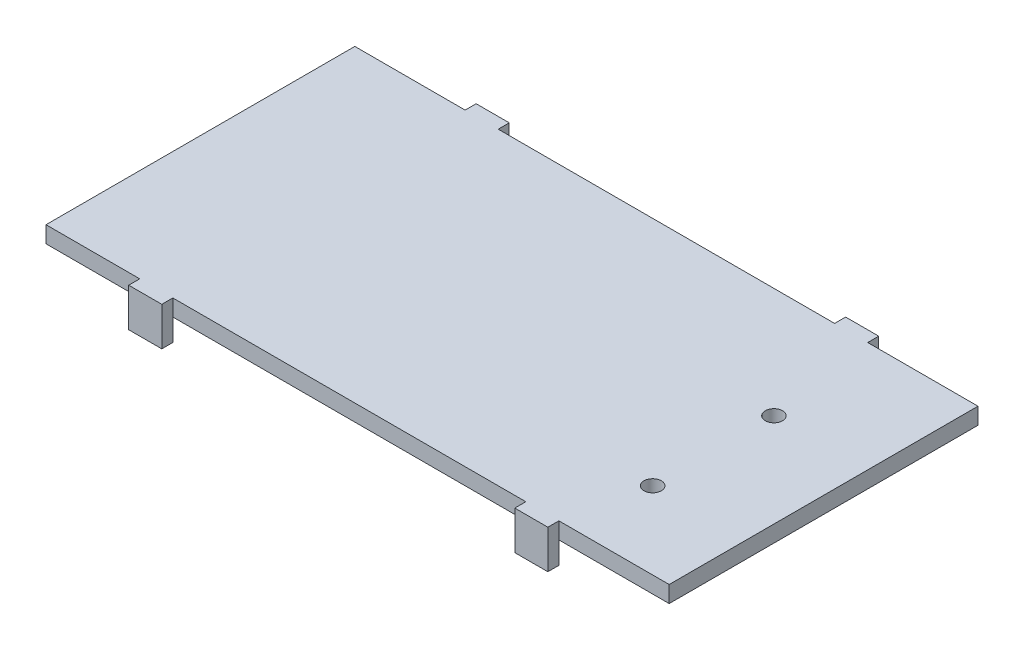
ISO-10303-21;
HEADER;
FILE_DESCRIPTION(('STEP AP214'),'2;1');
FILE_NAME('part.step','',(''),(''),'','','');
FILE_SCHEMA(('AUTOMOTIVE_DESIGN { 1 0 10303 214 1 1 1 1 }'));
ENDSEC;
DATA;
#1=APPLICATION_CONTEXT('core data for automotive mechanical design processes');
#2=APPLICATION_PROTOCOL_DEFINITION('international standard','automotive_design',2000,#1);
#3=PRODUCT_CONTEXT('',#1,'mechanical');
#4=PRODUCT('Part','Part','',(#3));
#5=PRODUCT_RELATED_PRODUCT_CATEGORY('part','',(#4));
#6=PRODUCT_DEFINITION_FORMATION('','',#4);
#7=PRODUCT_DEFINITION_CONTEXT('part definition',#1,'design');
#8=PRODUCT_DEFINITION('design','',#6,#7);
#9=PRODUCT_DEFINITION_SHAPE('','',#8);
#10=(LENGTH_UNIT() NAMED_UNIT(*) SI_UNIT(.MILLI.,.METRE.));
#11=(NAMED_UNIT(*) PLANE_ANGLE_UNIT() SI_UNIT($,.RADIAN.));
#12=(NAMED_UNIT(*) SI_UNIT($,.STERADIAN.) SOLID_ANGLE_UNIT());
#13=UNCERTAINTY_MEASURE_WITH_UNIT(LENGTH_MEASURE(1.E-05),#10,'distance_accuracy_value','');
#14=(GEOMETRIC_REPRESENTATION_CONTEXT(3) GLOBAL_UNCERTAINTY_ASSIGNED_CONTEXT((#13)) GLOBAL_UNIT_ASSIGNED_CONTEXT((#10,
#11,#12)) REPRESENTATION_CONTEXT('',''));
#15=CARTESIAN_POINT('',(0.,0.,0.));
#16=DIRECTION('',(0.,0.,1.));
#17=DIRECTION('',(1.,0.,0.));
#18=AXIS2_PLACEMENT_3D('',#15,#16,#17);
#19=CARTESIAN_POINT('',(-75.3322287390029,3.81,44.8168475073314));
#20=DIRECTION('',(0.,0.,-1.));
#21=DIRECTION('',(-1.,0.,0.));
#22=AXIS2_PLACEMENT_3D('',#19,#20,#21);
#23=PLANE('',#22);
#24=DIRECTION('',(1.,0.,0.));
#25=VECTOR('',#24,1.);
#26=CARTESIAN_POINT('',(-75.3322287390029,0.,44.8168475073314));
#27=LINE('',#26,#25);
#28=CARTESIAN_POINT('',(-46.1222287390029,0.,44.8168475073314));
#29=VERTEX_POINT('',#28);
#30=CARTESIAN_POINT('',(35.1577712609971,0.,44.8168475073314));
#31=VERTEX_POINT('',#30);
#32=EDGE_CURVE('E406',#29,#31,#27,.T.);
#33=ORIENTED_EDGE('',*,*,#32,.T.);
#34=DIRECTION('',(0.,1.,0.));
#35=VECTOR('',#34,1.);
#36=CARTESIAN_POINT('',(35.1577712609971,-5.08,44.8168475073314));
#37=LINE('',#36,#35);
#38=CARTESIAN_POINT('',(35.1577712609971,3.81,44.8168475073314));
#39=VERTEX_POINT('',#38);
#40=EDGE_CURVE('E59',#31,#39,#37,.T.);
#41=ORIENTED_EDGE('',*,*,#40,.T.);
#42=DIRECTION('',(1.,0.,0.));
#43=VECTOR('',#42,1.);
#44=CARTESIAN_POINT('',(-75.3322287390029,3.81,44.8168475073314));
#45=LINE('',#44,#43);
#46=CARTESIAN_POINT('',(-46.1222287390029,3.81,44.8168475073314));
#47=VERTEX_POINT('',#46);
#48=EDGE_CURVE('E349',#47,#39,#45,.T.);
#49=ORIENTED_EDGE('',*,*,#48,.F.);
#50=DIRECTION('',(0.,1.,0.));
#51=VECTOR('',#50,1.);
#52=CARTESIAN_POINT('',(-46.1222287390029,-5.08,44.8168475073314));
#53=LINE('',#52,#51);
#54=EDGE_CURVE('E11',#29,#47,#53,.T.);
#55=ORIENTED_EDGE('',*,*,#54,.F.);
#56=EDGE_LOOP('',(#33,#41,#49,#55));
#57=FACE_BOUND('',#56,.T.);
#58=ADVANCED_FACE('F33',(#57),#23,.F.);
#59=CARTESIAN_POINT('',(42.7777712609971,3.81,44.8168475073314));
#60=VERTEX_POINT('',#59);
#61=CARTESIAN_POINT('',(68.1777712609971,3.81,44.8168475073314));
#62=VERTEX_POINT('',#61);
#63=EDGE_CURVE('E51',#60,#62,#45,.T.);
#64=ORIENTED_EDGE('',*,*,#63,.F.);
#65=DIRECTION('',(0.,1.,0.));
#66=VECTOR('',#65,1.);
#67=CARTESIAN_POINT('',(42.7777712609971,-5.08,44.8168475073314));
#68=LINE('',#67,#66);
#69=CARTESIAN_POINT('',(42.7777712609971,0.,44.8168475073314));
#70=VERTEX_POINT('',#69);
#71=EDGE_CURVE('E244',#70,#60,#68,.T.);
#72=ORIENTED_EDGE('',*,*,#71,.F.);
#73=CARTESIAN_POINT('',(68.1777712609971,0.,44.8168475073314));
#74=VERTEX_POINT('',#73);
#75=EDGE_CURVE('E359',#70,#74,#27,.T.);
#76=ORIENTED_EDGE('',*,*,#75,.T.);
#77=DIRECTION('',(0.,-1.,0.));
#78=VECTOR('',#77,1.);
#79=CARTESIAN_POINT('',(68.1777712609971,3.81,44.8168475073314));
#80=LINE('',#79,#78);
#81=EDGE_CURVE('E376',#62,#74,#80,.T.);
#82=ORIENTED_EDGE('',*,*,#81,.F.);
#83=EDGE_LOOP('',(#64,#72,#76,#82));
#84=FACE_BOUND('',#83,.T.);
#85=ADVANCED_FACE('F412',(#84),#23,.F.);
#86=CARTESIAN_POINT('',(-75.3322287390029,3.81,-26.3031524926686));
#87=DIRECTION('',(0.,0.,1.));
#88=DIRECTION('',(1.,0.,0.));
#89=AXIS2_PLACEMENT_3D('',#86,#87,#88);
#90=PLANE('',#89);
#91=DIRECTION('',(-1.,0.,0.));
#92=VECTOR('',#91,1.);
#93=CARTESIAN_POINT('',(-75.3322287390029,3.81,-26.3031524926686));
#94=LINE('',#93,#92);
#95=CARTESIAN_POINT('',(35.1577712609971,3.81,-26.3031524926686));
#96=VERTEX_POINT('',#95);
#97=CARTESIAN_POINT('',(-42.3122287390029,3.81,-26.3031524926686));
#98=VERTEX_POINT('',#97);
#99=EDGE_CURVE('E356',#96,#98,#94,.T.);
#100=ORIENTED_EDGE('',*,*,#99,.F.);
#101=DIRECTION('',(0.,1.,0.));
#102=VECTOR('',#101,1.);
#103=CARTESIAN_POINT('',(35.1577712609971,-5.08,-26.3031524926686));
#104=LINE('',#103,#102);
#105=CARTESIAN_POINT('',(35.1577712609971,0.,-26.3031524926686));
#106=VERTEX_POINT('',#105);
#107=EDGE_CURVE('E288',#106,#96,#104,.T.);
#108=ORIENTED_EDGE('',*,*,#107,.F.);
#109=DIRECTION('',(-1.,0.,0.));
#110=VECTOR('',#109,1.);
#111=CARTESIAN_POINT('',(-75.3322287390029,0.,-26.3031524926686));
#112=LINE('',#111,#110);
#113=CARTESIAN_POINT('',(-42.3122287390029,0.,-26.3031524926686));
#114=VERTEX_POINT('',#113);
#115=EDGE_CURVE('E370',#106,#114,#112,.T.);
#116=ORIENTED_EDGE('',*,*,#115,.T.);
#117=DIRECTION('',(0.,1.,0.));
#118=VECTOR('',#117,1.);
#119=CARTESIAN_POINT('',(-42.3122287390029,-5.08,-26.3031524926686));
#120=LINE('',#119,#118);
#121=EDGE_CURVE('E337',#114,#98,#120,.T.);
#122=ORIENTED_EDGE('',*,*,#121,.T.);
#123=EDGE_LOOP('',(#100,#108,#116,#122));
#124=FACE_BOUND('',#123,.T.);
#125=ADVANCED_FACE('F436',(#124),#90,.F.);
#126=DIRECTION('',(0.,1.,0.));
#127=VECTOR('',#126,1.);
#128=CARTESIAN_POINT('',(-49.9322287390029,-5.08,-26.3031524926686));
#129=LINE('',#128,#127);
#130=CARTESIAN_POINT('',(-49.9322287390029,0.,-26.3031524926686));
#131=VERTEX_POINT('',#130);
#132=CARTESIAN_POINT('',(-49.9322287390029,3.81,-26.3031524926686));
#133=VERTEX_POINT('',#132);
#134=EDGE_CURVE('E340',#131,#133,#129,.T.);
#135=ORIENTED_EDGE('',*,*,#134,.F.);
#136=CARTESIAN_POINT('',(-75.3322287390029,0.,-26.3031524926686));
#137=VERTEX_POINT('',#136);
#138=EDGE_CURVE('E366',#131,#137,#112,.T.);
#139=ORIENTED_EDGE('',*,*,#138,.T.);
#140=DIRECTION('',(0.,-1.,0.));
#141=VECTOR('',#140,1.);
#142=CARTESIAN_POINT('',(-75.3322287390029,3.81,-26.3031524926686));
#143=LINE('',#142,#141);
#144=CARTESIAN_POINT('',(-75.3322287390029,3.81,-26.3031524926686));
#145=VERTEX_POINT('',#144);
#146=EDGE_CURVE('E355',#145,#137,#143,.T.);
#147=ORIENTED_EDGE('',*,*,#146,.F.);
#148=EDGE_CURVE('E351',#133,#145,#94,.T.);
#149=ORIENTED_EDGE('',*,*,#148,.F.);
#150=EDGE_LOOP('',(#135,#139,#147,#149));
#151=FACE_BOUND('',#150,.T.);
#152=ADVANCED_FACE('F446',(#151),#90,.F.);
#153=CARTESIAN_POINT('',(-75.3322287390029,3.81,-26.3031524926686));
#154=DIRECTION('',(1.,0.,0.));
#155=DIRECTION('',(0.,0.,-1.));
#156=AXIS2_PLACEMENT_3D('',#153,#154,#155);
#157=PLANE('',#156);
#158=DIRECTION('',(0.,0.,1.));
#159=VECTOR('',#158,1.);
#160=CARTESIAN_POINT('',(-75.3322287390029,0.,-26.3031524926686));
#161=LINE('',#160,#159);
#162=CARTESIAN_POINT('',(-75.3322287390029,0.,44.8168475073314));
#163=VERTEX_POINT('',#162);
#164=EDGE_CURVE('E331',#137,#163,#161,.T.);
#165=ORIENTED_EDGE('',*,*,#164,.T.);
#166=DIRECTION('',(0.,-1.,0.));
#167=VECTOR('',#166,1.);
#168=CARTESIAN_POINT('',(-75.3322287390029,3.81,44.8168475073314));
#169=LINE('',#168,#167);
#170=CARTESIAN_POINT('',(-75.3322287390029,3.81,44.8168475073314));
#171=VERTEX_POINT('',#170);
#172=EDGE_CURVE('E37',#171,#163,#169,.T.);
#173=ORIENTED_EDGE('',*,*,#172,.F.);
#174=DIRECTION('',(0.,0.,1.));
#175=VECTOR('',#174,1.);
#176=CARTESIAN_POINT('',(-75.3322287390029,3.81,-26.3031524926686));
#177=LINE('',#176,#175);
#178=EDGE_CURVE('E341',#145,#171,#177,.T.);
#179=ORIENTED_EDGE('',*,*,#178,.F.);
#180=ORIENTED_EDGE('',*,*,#146,.T.);
#181=EDGE_LOOP('',(#165,#173,#179,#180));
#182=FACE_BOUND('',#181,.T.);
#183=ADVANCED_FACE('F35',(#182),#157,.F.);
#184=CARTESIAN_POINT('',(-53.7422287390029,0.,44.8168475073314));
#185=VERTEX_POINT('',#184);
#186=EDGE_CURVE('E360',#163,#185,#27,.T.);
#187=ORIENTED_EDGE('',*,*,#186,.T.);
#188=DIRECTION('',(0.,1.,0.));
#189=VECTOR('',#188,1.);
#190=CARTESIAN_POINT('',(-53.7422287390029,-5.08,44.8168475073314));
#191=LINE('',#190,#189);
#192=CARTESIAN_POINT('',(-53.7422287390029,3.81,44.8168475073314));
#193=VERTEX_POINT('',#192);
#194=EDGE_CURVE('E42',#185,#193,#191,.T.);
#195=ORIENTED_EDGE('',*,*,#194,.T.);
#196=EDGE_CURVE('E345',#171,#193,#45,.T.);
#197=ORIENTED_EDGE('',*,*,#196,.F.);
#198=ORIENTED_EDGE('',*,*,#172,.T.);
#199=EDGE_LOOP('',(#187,#195,#197,#198));
#200=FACE_BOUND('',#199,.T.);
#201=ADVANCED_FACE('F391',(#200),#23,.F.);
#202=CARTESIAN_POINT('',(68.1777712609971,3.81,-26.3031524926686));
#203=DIRECTION('',(-1.,0.,0.));
#204=DIRECTION('',(0.,0.,1.));
#205=AXIS2_PLACEMENT_3D('',#202,#203,#204);
#206=PLANE('',#205);
#207=DIRECTION('',(0.,0.,-1.));
#208=VECTOR('',#207,1.);
#209=CARTESIAN_POINT('',(68.1777712609971,0.,-26.3031524926686));
#210=LINE('',#209,#208);
#211=CARTESIAN_POINT('',(68.1777712609971,0.,-26.3031524926686));
#212=VERTEX_POINT('',#211);
#213=EDGE_CURVE('E363',#74,#212,#210,.T.);
#214=ORIENTED_EDGE('',*,*,#213,.T.);
#215=DIRECTION('',(0.,-1.,0.));
#216=VECTOR('',#215,1.);
#217=CARTESIAN_POINT('',(68.1777712609971,3.81,-26.3031524926686));
#218=LINE('',#217,#216);
#219=CARTESIAN_POINT('',(68.1777712609971,3.81,-26.3031524926686));
#220=VERTEX_POINT('',#219);
#221=EDGE_CURVE('E374',#220,#212,#218,.T.);
#222=ORIENTED_EDGE('',*,*,#221,.F.);
#223=DIRECTION('',(0.,0.,-1.));
#224=VECTOR('',#223,1.);
#225=CARTESIAN_POINT('',(68.1777712609971,3.81,-26.3031524926686));
#226=LINE('',#225,#224);
#227=EDGE_CURVE('E348',#62,#220,#226,.T.);
#228=ORIENTED_EDGE('',*,*,#227,.F.);
#229=ORIENTED_EDGE('',*,*,#81,.T.);
#230=EDGE_LOOP('',(#214,#222,#228,#229));
#231=FACE_BOUND('',#230,.T.);
#232=ADVANCED_FACE('F415',(#231),#206,.F.);
#233=CARTESIAN_POINT('',(42.7777712609971,0.,-26.3031524926686));
#234=VERTEX_POINT('',#233);
#235=EDGE_CURVE('E344',#212,#234,#112,.T.);
#236=ORIENTED_EDGE('',*,*,#235,.T.);
#237=DIRECTION('',(0.,1.,0.));
#238=VECTOR('',#237,1.);
#239=CARTESIAN_POINT('',(42.7777712609971,-5.08,-26.3031524926686));
#240=LINE('',#239,#238);
#241=CARTESIAN_POINT('',(42.7777712609971,3.81,-26.3031524926686));
#242=VERTEX_POINT('',#241);
#243=EDGE_CURVE('E304',#234,#242,#240,.T.);
#244=ORIENTED_EDGE('',*,*,#243,.T.);
#245=EDGE_CURVE('E352',#220,#242,#94,.T.);
#246=ORIENTED_EDGE('',*,*,#245,.F.);
#247=ORIENTED_EDGE('',*,*,#221,.T.);
#248=EDGE_LOOP('',(#236,#244,#246,#247));
#249=FACE_BOUND('',#248,.T.);
#250=ADVANCED_FACE('F418',(#249),#90,.F.);
#251=CARTESIAN_POINT('',(0.,3.81,0.));
#252=DIRECTION('',(0.,1.,0.));
#253=DIRECTION('',(0.,0.,1.));
#254=AXIS2_PLACEMENT_3D('',#251,#252,#253);
#255=PLANE('',#254);
#256=CARTESIAN_POINT('',(46.5877712609971,3.81,27.0368475073314));
#257=DIRECTION('',(0.,-1.,0.));
#258=DIRECTION('',(0.,0.,-1.));
#259=AXIS2_PLACEMENT_3D('',#256,#257,#258);
#260=CIRCLE('',#259,2.);
#261=CARTESIAN_POINT('',(46.5877712609971,3.81,25.0368475073314));
#262=VERTEX_POINT('',#261);
#263=EDGE_CURVE('E237',#262,#262,#260,.T.);
#264=ORIENTED_EDGE('',*,*,#263,.T.);
#265=EDGE_LOOP('',(#264));
#266=FACE_BOUND('',#265,.T.);
#267=CARTESIAN_POINT('',(46.5877712609971,3.81,-0.903152492668632));
#268=DIRECTION('',(0.,-1.,0.));
#269=DIRECTION('',(0.,0.,-1.));
#270=AXIS2_PLACEMENT_3D('',#267,#268,#269);
#271=CIRCLE('',#270,2.);
#272=CARTESIAN_POINT('',(46.5877712609971,3.81,-2.90315249266864));
#273=VERTEX_POINT('',#272);
#274=EDGE_CURVE('E740',#273,#273,#271,.T.);
#275=ORIENTED_EDGE('',*,*,#274,.T.);
#276=EDGE_LOOP('',(#275));
#277=FACE_BOUND('',#276,.T.);
#278=ORIENTED_EDGE('',*,*,#178,.T.);
#279=ORIENTED_EDGE('',*,*,#196,.T.);
#280=DIRECTION('',(0.,0.,1.));
#281=VECTOR('',#280,1.);
#282=CARTESIAN_POINT('',(-53.7422287390029,3.81,47.3568475073314));
#283=LINE('',#282,#281);
#284=CARTESIAN_POINT('',(-53.7422287390029,3.81,47.3568475073314));
#285=VERTEX_POINT('',#284);
#286=EDGE_CURVE('E240',#193,#285,#283,.T.);
#287=ORIENTED_EDGE('',*,*,#286,.T.);
#288=DIRECTION('',(1.,0.,0.));
#289=VECTOR('',#288,1.);
#290=CARTESIAN_POINT('',(-53.7422287390029,3.81,47.3568475073314));
#291=LINE('',#290,#289);
#292=CARTESIAN_POINT('',(-46.1222287390029,3.81,47.3568475073314));
#293=VERTEX_POINT('',#292);
#294=EDGE_CURVE('E262',#285,#293,#291,.T.);
#295=ORIENTED_EDGE('',*,*,#294,.T.);
#296=DIRECTION('',(0.,0.,-1.));
#297=VECTOR('',#296,1.);
#298=CARTESIAN_POINT('',(-46.1222287390029,3.81,47.3568475073314));
#299=LINE('',#298,#297);
#300=EDGE_CURVE('E250',#293,#47,#299,.T.);
#301=ORIENTED_EDGE('',*,*,#300,.T.);
#302=ORIENTED_EDGE('',*,*,#48,.T.);
#303=DIRECTION('',(0.,0.,1.));
#304=VECTOR('',#303,1.);
#305=CARTESIAN_POINT('',(35.1577712609971,3.81,47.3568475073314));
#306=LINE('',#305,#304);
#307=CARTESIAN_POINT('',(35.1577712609971,3.81,47.3568475073314));
#308=VERTEX_POINT('',#307);
#309=EDGE_CURVE('E235',#39,#308,#306,.T.);
#310=ORIENTED_EDGE('',*,*,#309,.T.);
#311=DIRECTION('',(1.,0.,0.));
#312=VECTOR('',#311,1.);
#313=CARTESIAN_POINT('',(35.1577712609971,3.81,47.3568475073314));
#314=LINE('',#313,#312);
#315=CARTESIAN_POINT('',(42.7777712609971,3.81,47.3568475073314));
#316=VERTEX_POINT('',#315);
#317=EDGE_CURVE('E204',#308,#316,#314,.T.);
#318=ORIENTED_EDGE('',*,*,#317,.T.);
#319=DIRECTION('',(0.,0.,-1.));
#320=VECTOR('',#319,1.);
#321=CARTESIAN_POINT('',(42.7777712609971,3.81,47.3568475073314));
#322=LINE('',#321,#320);
#323=EDGE_CURVE('E225',#316,#60,#322,.T.);
#324=ORIENTED_EDGE('',*,*,#323,.T.);
#325=ORIENTED_EDGE('',*,*,#63,.T.);
#326=ORIENTED_EDGE('',*,*,#227,.T.);
#327=ORIENTED_EDGE('',*,*,#245,.T.);
#328=DIRECTION('',(0.,0.,-1.));
#329=VECTOR('',#328,1.);
#330=CARTESIAN_POINT('',(42.7777712609971,3.81,-26.3031524926686));
#331=LINE('',#330,#329);
#332=CARTESIAN_POINT('',(42.7777712609971,3.81,-28.8431524926686));
#333=VERTEX_POINT('',#332);
#334=EDGE_CURVE('E291',#242,#333,#331,.T.);
#335=ORIENTED_EDGE('',*,*,#334,.T.);
#336=DIRECTION('',(-1.,0.,0.));
#337=VECTOR('',#336,1.);
#338=CARTESIAN_POINT('',(35.1577712609971,3.81,-28.8431524926686));
#339=LINE('',#338,#337);
#340=CARTESIAN_POINT('',(35.1577712609971,3.81,-28.8431524926686));
#341=VERTEX_POINT('',#340);
#342=EDGE_CURVE('E279',#333,#341,#339,.T.);
#343=ORIENTED_EDGE('',*,*,#342,.T.);
#344=DIRECTION('',(0.,0.,1.));
#345=VECTOR('',#344,1.);
#346=CARTESIAN_POINT('',(35.1577712609971,3.81,-26.3031524926686));
#347=LINE('',#346,#345);
#348=EDGE_CURVE('E269',#341,#96,#347,.T.);
#349=ORIENTED_EDGE('',*,*,#348,.T.);
#350=ORIENTED_EDGE('',*,*,#99,.T.);
#351=DIRECTION('',(0.,0.,-1.));
#352=VECTOR('',#351,1.);
#353=CARTESIAN_POINT('',(-42.3122287390029,3.81,-26.3031524926686));
#354=LINE('',#353,#352);
#355=CARTESIAN_POINT('',(-42.3122287390029,3.81,-28.8431524926686));
#356=VERTEX_POINT('',#355);
#357=EDGE_CURVE('E324',#98,#356,#354,.T.);
#358=ORIENTED_EDGE('',*,*,#357,.T.);
#359=DIRECTION('',(-1.,0.,0.));
#360=VECTOR('',#359,1.);
#361=CARTESIAN_POINT('',(-49.9322287390029,3.81,-28.8431524926686));
#362=LINE('',#361,#360);
#363=CARTESIAN_POINT('',(-49.9322287390029,3.81,-28.8431524926686));
#364=VERTEX_POINT('',#363);
#365=EDGE_CURVE('E312',#356,#364,#362,.T.);
#366=ORIENTED_EDGE('',*,*,#365,.T.);
#367=DIRECTION('',(0.,0.,1.));
#368=VECTOR('',#367,1.);
#369=CARTESIAN_POINT('',(-49.9322287390029,3.81,-26.3031524926686));
#370=LINE('',#369,#368);
#371=EDGE_CURVE('E298',#364,#133,#370,.T.);
#372=ORIENTED_EDGE('',*,*,#371,.T.);
#373=ORIENTED_EDGE('',*,*,#148,.T.);
#374=EDGE_LOOP('',(#278,#279,#287,#295,#301,#302,#310,#318,#324,#325,#326,#327,#335,#343,#349,
#350,#358,#366,#372,#373));
#375=FACE_BOUND('',#374,.T.);
#376=ADVANCED_FACE('F394',(#266,#277,#375),#255,.T.);
#377=CARTESIAN_POINT('',(0.,0.,0.));
#378=DIRECTION('',(0.,1.,0.));
#379=DIRECTION('',(0.,0.,1.));
#380=AXIS2_PLACEMENT_3D('',#377,#378,#379);
#381=PLANE('',#380);
#382=CARTESIAN_POINT('',(46.5877712609971,0.,27.0368475073314));
#383=DIRECTION('',(0.,-1.,0.));
#384=DIRECTION('',(0.,0.,-1.));
#385=AXIS2_PLACEMENT_3D('',#382,#383,#384);
#386=CIRCLE('',#385,2.);
#387=CARTESIAN_POINT('',(46.5877712609971,0.,25.0368475073314));
#388=VERTEX_POINT('',#387);
#389=EDGE_CURVE('E739',#388,#388,#386,.T.);
#390=ORIENTED_EDGE('',*,*,#389,.F.);
#391=EDGE_LOOP('',(#390));
#392=FACE_BOUND('',#391,.T.);
#393=CARTESIAN_POINT('',(46.5877712609971,0.,-0.903152492668632));
#394=DIRECTION('',(0.,-1.,0.));
#395=DIRECTION('',(0.,0.,-1.));
#396=AXIS2_PLACEMENT_3D('',#393,#394,#395);
#397=CIRCLE('',#396,2.);
#398=CARTESIAN_POINT('',(46.5877712609971,0.,-2.90315249266864));
#399=VERTEX_POINT('',#398);
#400=EDGE_CURVE('E230',#399,#399,#397,.T.);
#401=ORIENTED_EDGE('',*,*,#400,.F.);
#402=EDGE_LOOP('',(#401));
#403=FACE_BOUND('',#402,.T.);
#404=ORIENTED_EDGE('',*,*,#164,.F.);
#405=ORIENTED_EDGE('',*,*,#138,.F.);
#406=EDGE_CURVE('E371',#114,#131,#112,.T.);
#407=ORIENTED_EDGE('',*,*,#406,.F.);
#408=ORIENTED_EDGE('',*,*,#115,.F.);
#409=EDGE_CURVE('E369',#234,#106,#112,.T.);
#410=ORIENTED_EDGE('',*,*,#409,.F.);
#411=ORIENTED_EDGE('',*,*,#235,.F.);
#412=ORIENTED_EDGE('',*,*,#213,.F.);
#413=ORIENTED_EDGE('',*,*,#75,.F.);
#414=EDGE_CURVE('E408',#31,#70,#27,.T.);
#415=ORIENTED_EDGE('',*,*,#414,.F.);
#416=ORIENTED_EDGE('',*,*,#32,.F.);
#417=EDGE_CURVE('E364',#185,#29,#27,.T.);
#418=ORIENTED_EDGE('',*,*,#417,.F.);
#419=ORIENTED_EDGE('',*,*,#186,.F.);
#420=EDGE_LOOP('',(#404,#405,#407,#408,#410,#411,#412,#413,#415,#416,#418,#419));
#421=FACE_BOUND('',#420,.T.);
#422=ADVANCED_FACE('F402',(#392,#403,#421),#381,.F.);
#423=CARTESIAN_POINT('',(-49.9322287390029,-5.08,-26.3031524926686));
#424=DIRECTION('',(-1.,0.,0.));
#425=DIRECTION('',(0.,0.,1.));
#426=AXIS2_PLACEMENT_3D('',#423,#424,#425);
#427=PLANE('',#426);
#428=ORIENTED_EDGE('',*,*,#371,.F.);
#429=DIRECTION('',(0.,1.,0.));
#430=VECTOR('',#429,1.);
#431=CARTESIAN_POINT('',(-49.9322287390029,-5.08,-28.8431524926686));
#432=LINE('',#431,#430);
#433=CARTESIAN_POINT('',(-49.9322287390029,-5.08,-28.8431524926686));
#434=VERTEX_POINT('',#433);
#435=EDGE_CURVE('E329',#434,#364,#432,.T.);
#436=ORIENTED_EDGE('',*,*,#435,.F.);
#437=DIRECTION('',(0.,0.,1.));
#438=VECTOR('',#437,1.);
#439=CARTESIAN_POINT('',(-49.9322287390029,-5.08,-26.3031524926686));
#440=LINE('',#439,#438);
#441=CARTESIAN_POINT('',(-49.9322287390029,-5.08,-26.3031524926686));
#442=VERTEX_POINT('',#441);
#443=EDGE_CURVE('E308',#434,#442,#440,.T.);
#444=ORIENTED_EDGE('',*,*,#443,.T.);
#445=EDGE_CURVE('E321',#442,#131,#129,.T.);
#446=ORIENTED_EDGE('',*,*,#445,.T.);
#447=ORIENTED_EDGE('',*,*,#134,.T.);
#448=EDGE_LOOP('',(#428,#436,#444,#446,#447));
#449=FACE_BOUND('',#448,.T.);
#450=ADVANCED_FACE('F444',(#449),#427,.T.);
#451=CARTESIAN_POINT('',(-49.9322287390029,-5.08,-28.8431524926686));
#452=DIRECTION('',(0.,0.,-1.));
#453=DIRECTION('',(-1.,0.,0.));
#454=AXIS2_PLACEMENT_3D('',#451,#452,#453);
#455=PLANE('',#454);
#456=ORIENTED_EDGE('',*,*,#365,.F.);
#457=DIRECTION('',(0.,1.,0.));
#458=VECTOR('',#457,1.);
#459=CARTESIAN_POINT('',(-42.3122287390029,-5.08,-28.8431524926686));
#460=LINE('',#459,#458);
#461=CARTESIAN_POINT('',(-42.3122287390029,-5.08,-28.8431524926686));
#462=VERTEX_POINT('',#461);
#463=EDGE_CURVE('E332',#462,#356,#460,.T.);
#464=ORIENTED_EDGE('',*,*,#463,.F.);
#465=DIRECTION('',(-1.,0.,0.));
#466=VECTOR('',#465,1.);
#467=CARTESIAN_POINT('',(-49.9322287390029,-5.08,-28.8431524926686));
#468=LINE('',#467,#466);
#469=EDGE_CURVE('E318',#462,#434,#468,.T.);
#470=ORIENTED_EDGE('',*,*,#469,.T.);
#471=ORIENTED_EDGE('',*,*,#435,.T.);
#472=EDGE_LOOP('',(#456,#464,#470,#471));
#473=FACE_BOUND('',#472,.T.);
#474=ADVANCED_FACE('F492',(#473),#455,.T.);
#475=CARTESIAN_POINT('',(-42.3122287390029,-5.08,-26.3031524926686));
#476=DIRECTION('',(1.,0.,0.));
#477=DIRECTION('',(0.,0.,-1.));
#478=AXIS2_PLACEMENT_3D('',#475,#476,#477);
#479=PLANE('',#478);
#480=ORIENTED_EDGE('',*,*,#357,.F.);
#481=ORIENTED_EDGE('',*,*,#121,.F.);
#482=CARTESIAN_POINT('',(-42.3122287390029,-5.08,-26.3031524926686));
#483=VERTEX_POINT('',#482);
#484=EDGE_CURVE('E334',#483,#114,#120,.T.);
#485=ORIENTED_EDGE('',*,*,#484,.F.);
#486=DIRECTION('',(0.,0.,-1.));
#487=VECTOR('',#486,1.);
#488=CARTESIAN_POINT('',(-42.3122287390029,-5.08,-26.3031524926686));
#489=LINE('',#488,#487);
#490=EDGE_CURVE('E315',#483,#462,#489,.T.);
#491=ORIENTED_EDGE('',*,*,#490,.T.);
#492=ORIENTED_EDGE('',*,*,#463,.T.);
#493=EDGE_LOOP('',(#480,#481,#485,#491,#492));
#494=FACE_BOUND('',#493,.T.);
#495=ADVANCED_FACE('F499',(#494),#479,.T.);
#496=CARTESIAN_POINT('',(-49.9322287390029,-5.08,-26.3031524926686));
#497=DIRECTION('',(0.,0.,1.));
#498=DIRECTION('',(1.,0.,0.));
#499=AXIS2_PLACEMENT_3D('',#496,#497,#498);
#500=PLANE('',#499);
#501=ORIENTED_EDGE('',*,*,#484,.T.);
#502=ORIENTED_EDGE('',*,*,#406,.T.);
#503=ORIENTED_EDGE('',*,*,#445,.F.);
#504=DIRECTION('',(1.,0.,0.));
#505=VECTOR('',#504,1.);
#506=CARTESIAN_POINT('',(-49.9322287390029,-5.08,-26.3031524926686));
#507=LINE('',#506,#505);
#508=EDGE_CURVE('E311',#442,#483,#507,.T.);
#509=ORIENTED_EDGE('',*,*,#508,.T.);
#510=EDGE_LOOP('',(#501,#502,#503,#509));
#511=FACE_BOUND('',#510,.T.);
#512=ADVANCED_FACE('F442',(#511),#500,.T.);
#513=CARTESIAN_POINT('',(0.,-5.08,0.));
#514=DIRECTION('',(0.,-1.,0.));
#515=DIRECTION('',(0.,0.,-1.));
#516=AXIS2_PLACEMENT_3D('',#513,#514,#515);
#517=PLANE('',#516);
#518=ORIENTED_EDGE('',*,*,#443,.F.);
#519=ORIENTED_EDGE('',*,*,#469,.F.);
#520=ORIENTED_EDGE('',*,*,#490,.F.);
#521=ORIENTED_EDGE('',*,*,#508,.F.);
#522=EDGE_LOOP('',(#518,#519,#520,#521));
#523=FACE_BOUND('',#522,.T.);
#524=ADVANCED_FACE('F514',(#523),#517,.T.);
#525=CARTESIAN_POINT('',(35.1577712609971,-5.08,-26.3031524926686));
#526=DIRECTION('',(0.,0.,1.));
#527=DIRECTION('',(1.,0.,0.));
#528=AXIS2_PLACEMENT_3D('',#525,#526,#527);
#529=PLANE('',#528);
#530=ORIENTED_EDGE('',*,*,#409,.T.);
#531=CARTESIAN_POINT('',(35.1577712609971,-5.08,-26.3031524926686));
#532=VERTEX_POINT('',#531);
#533=EDGE_CURVE('E305',#532,#106,#104,.T.);
#534=ORIENTED_EDGE('',*,*,#533,.F.);
#535=DIRECTION('',(1.,0.,0.));
#536=VECTOR('',#535,1.);
#537=CARTESIAN_POINT('',(35.1577712609971,-5.08,-26.3031524926686));
#538=LINE('',#537,#536);
#539=CARTESIAN_POINT('',(42.7777712609971,-5.08,-26.3031524926686));
#540=VERTEX_POINT('',#539);
#541=EDGE_CURVE('E278',#532,#540,#538,.T.);
#542=ORIENTED_EDGE('',*,*,#541,.T.);
#543=EDGE_CURVE('E301',#540,#234,#240,.T.);
#544=ORIENTED_EDGE('',*,*,#543,.T.);
#545=EDGE_LOOP('',(#530,#534,#542,#544));
#546=FACE_BOUND('',#545,.T.);
#547=ADVANCED_FACE('F438',(#546),#529,.T.);
#548=CARTESIAN_POINT('',(35.1577712609971,-5.08,-26.3031524926686));
#549=DIRECTION('',(-1.,0.,0.));
#550=DIRECTION('',(0.,0.,1.));
#551=AXIS2_PLACEMENT_3D('',#548,#549,#550);
#552=PLANE('',#551);
#553=ORIENTED_EDGE('',*,*,#348,.F.);
#554=DIRECTION('',(0.,1.,0.));
#555=VECTOR('',#554,1.);
#556=CARTESIAN_POINT('',(35.1577712609971,-5.08,-28.8431524926686));
#557=LINE('',#556,#555);
#558=CARTESIAN_POINT('',(35.1577712609971,-5.08,-28.8431524926686));
#559=VERTEX_POINT('',#558);
#560=EDGE_CURVE('E296',#559,#341,#557,.T.);
#561=ORIENTED_EDGE('',*,*,#560,.F.);
#562=DIRECTION('',(0.,0.,1.));
#563=VECTOR('',#562,1.);
#564=CARTESIAN_POINT('',(35.1577712609971,-5.08,-26.3031524926686));
#565=LINE('',#564,#563);
#566=EDGE_CURVE('E275',#559,#532,#565,.T.);
#567=ORIENTED_EDGE('',*,*,#566,.T.);
#568=ORIENTED_EDGE('',*,*,#533,.T.);
#569=ORIENTED_EDGE('',*,*,#107,.T.);
#570=EDGE_LOOP('',(#553,#561,#567,#568,#569));
#571=FACE_BOUND('',#570,.T.);
#572=ADVANCED_FACE('F432',(#571),#552,.T.);
#573=CARTESIAN_POINT('',(35.1577712609971,-5.08,-28.8431524926686));
#574=DIRECTION('',(0.,0.,-1.));
#575=DIRECTION('',(-1.,0.,0.));
#576=AXIS2_PLACEMENT_3D('',#573,#574,#575);
#577=PLANE('',#576);
#578=ORIENTED_EDGE('',*,*,#342,.F.);
#579=DIRECTION('',(0.,1.,0.));
#580=VECTOR('',#579,1.);
#581=CARTESIAN_POINT('',(42.7777712609971,-5.08,-28.8431524926686));
#582=LINE('',#581,#580);
#583=CARTESIAN_POINT('',(42.7777712609971,-5.08,-28.8431524926686));
#584=VERTEX_POINT('',#583);
#585=EDGE_CURVE('E299',#584,#333,#582,.T.);
#586=ORIENTED_EDGE('',*,*,#585,.F.);
#587=DIRECTION('',(-1.,0.,0.));
#588=VECTOR('',#587,1.);
#589=CARTESIAN_POINT('',(35.1577712609971,-5.08,-28.8431524926686));
#590=LINE('',#589,#588);
#591=EDGE_CURVE('E285',#584,#559,#590,.T.);
#592=ORIENTED_EDGE('',*,*,#591,.T.);
#593=ORIENTED_EDGE('',*,*,#560,.T.);
#594=EDGE_LOOP('',(#578,#586,#592,#593));
#595=FACE_BOUND('',#594,.T.);
#596=ADVANCED_FACE('F427',(#595),#577,.T.);
#597=CARTESIAN_POINT('',(42.7777712609971,-5.08,-26.3031524926686));
#598=DIRECTION('',(1.,0.,0.));
#599=DIRECTION('',(0.,0.,-1.));
#600=AXIS2_PLACEMENT_3D('',#597,#598,#599);
#601=PLANE('',#600);
#602=ORIENTED_EDGE('',*,*,#334,.F.);
#603=ORIENTED_EDGE('',*,*,#243,.F.);
#604=ORIENTED_EDGE('',*,*,#543,.F.);
#605=DIRECTION('',(0.,0.,-1.));
#606=VECTOR('',#605,1.);
#607=CARTESIAN_POINT('',(42.7777712609971,-5.08,-26.3031524926686));
#608=LINE('',#607,#606);
#609=EDGE_CURVE('E282',#540,#584,#608,.T.);
#610=ORIENTED_EDGE('',*,*,#609,.T.);
#611=ORIENTED_EDGE('',*,*,#585,.T.);
#612=EDGE_LOOP('',(#602,#603,#604,#610,#611));
#613=FACE_BOUND('',#612,.T.);
#614=ADVANCED_FACE('F423',(#613),#601,.T.);
#615=CARTESIAN_POINT('',(0.,-5.08,0.));
#616=DIRECTION('',(0.,-1.,0.));
#617=DIRECTION('',(0.,0.,-1.));
#618=AXIS2_PLACEMENT_3D('',#615,#616,#617);
#619=PLANE('',#618);
#620=ORIENTED_EDGE('',*,*,#566,.F.);
#621=ORIENTED_EDGE('',*,*,#591,.F.);
#622=ORIENTED_EDGE('',*,*,#609,.F.);
#623=ORIENTED_EDGE('',*,*,#541,.F.);
#624=EDGE_LOOP('',(#620,#621,#622,#623));
#625=FACE_BOUND('',#624,.T.);
#626=ADVANCED_FACE('F546',(#625),#619,.T.);
#627=CARTESIAN_POINT('',(-53.7422287390029,-5.08,47.3568475073314));
#628=DIRECTION('',(-1.,0.,0.));
#629=DIRECTION('',(0.,0.,1.));
#630=AXIS2_PLACEMENT_3D('',#627,#628,#629);
#631=PLANE('',#630);
#632=ORIENTED_EDGE('',*,*,#286,.F.);
#633=ORIENTED_EDGE('',*,*,#194,.F.);
#634=CARTESIAN_POINT('',(-53.7422287390029,-5.08,44.8168475073314));
#635=VERTEX_POINT('',#634);
#636=EDGE_CURVE('E267',#635,#185,#191,.T.);
#637=ORIENTED_EDGE('',*,*,#636,.F.);
#638=DIRECTION('',(0.,0.,1.));
#639=VECTOR('',#638,1.);
#640=CARTESIAN_POINT('',(-53.7422287390029,-5.08,47.3568475073314));
#641=LINE('',#640,#639);
#642=CARTESIAN_POINT('',(-53.7422287390029,-5.08,47.3568475073314));
#643=VERTEX_POINT('',#642);
#644=EDGE_CURVE('E246',#635,#643,#641,.T.);
#645=ORIENTED_EDGE('',*,*,#644,.T.);
#646=DIRECTION('',(0.,1.,0.));
#647=VECTOR('',#646,1.);
#648=CARTESIAN_POINT('',(-53.7422287390029,-5.08,47.3568475073314));
#649=LINE('',#648,#647);
#650=EDGE_CURVE('E259',#643,#285,#649,.T.);
#651=ORIENTED_EDGE('',*,*,#650,.T.);
#652=EDGE_LOOP('',(#632,#633,#637,#645,#651));
#653=FACE_BOUND('',#652,.T.);
#654=ADVANCED_FACE('F553',(#653),#631,.T.);
#655=CARTESIAN_POINT('',(-53.7422287390029,-5.08,44.8168475073314));
#656=DIRECTION('',(0.,0.,-1.));
#657=DIRECTION('',(-1.,0.,0.));
#658=AXIS2_PLACEMENT_3D('',#655,#656,#657);
#659=PLANE('',#658);
#660=ORIENTED_EDGE('',*,*,#636,.T.);
#661=ORIENTED_EDGE('',*,*,#417,.T.);
#662=CARTESIAN_POINT('',(-46.1222287390029,-5.08,44.8168475073314));
#663=VERTEX_POINT('',#662);
#664=EDGE_CURVE('E44',#663,#29,#53,.T.);
#665=ORIENTED_EDGE('',*,*,#664,.F.);
#666=DIRECTION('',(-1.,0.,0.));
#667=VECTOR('',#666,1.);
#668=CARTESIAN_POINT('',(-53.7422287390029,-5.08,44.8168475073314));
#669=LINE('',#668,#667);
#670=EDGE_CURVE('E256',#663,#635,#669,.T.);
#671=ORIENTED_EDGE('',*,*,#670,.T.);
#672=EDGE_LOOP('',(#660,#661,#665,#671));
#673=FACE_BOUND('',#672,.T.);
#674=ADVANCED_FACE('F561',(#673),#659,.T.);
#675=CARTESIAN_POINT('',(-46.1222287390029,-5.08,47.3568475073314));
#676=DIRECTION('',(1.,0.,0.));
#677=DIRECTION('',(0.,0.,-1.));
#678=AXIS2_PLACEMENT_3D('',#675,#676,#677);
#679=PLANE('',#678);
#680=ORIENTED_EDGE('',*,*,#300,.F.);
#681=DIRECTION('',(0.,1.,0.));
#682=VECTOR('',#681,1.);
#683=CARTESIAN_POINT('',(-46.1222287390029,-5.08,47.3568475073314));
#684=LINE('',#683,#682);
#685=CARTESIAN_POINT('',(-46.1222287390029,-5.08,47.3568475073314));
#686=VERTEX_POINT('',#685);
#687=EDGE_CURVE('E272',#686,#293,#684,.T.);
#688=ORIENTED_EDGE('',*,*,#687,.F.);
#689=DIRECTION('',(0.,0.,-1.));
#690=VECTOR('',#689,1.);
#691=CARTESIAN_POINT('',(-46.1222287390029,-5.08,47.3568475073314));
#692=LINE('',#691,#690);
#693=EDGE_CURVE('E253',#686,#663,#692,.T.);
#694=ORIENTED_EDGE('',*,*,#693,.T.);
#695=ORIENTED_EDGE('',*,*,#664,.T.);
#696=ORIENTED_EDGE('',*,*,#54,.T.);
#697=EDGE_LOOP('',(#680,#688,#694,#695,#696));
#698=FACE_BOUND('',#697,.T.);
#699=ADVANCED_FACE('F568',(#698),#679,.T.);
#700=CARTESIAN_POINT('',(-53.7422287390029,-5.08,47.3568475073314));
#701=DIRECTION('',(0.,0.,1.));
#702=DIRECTION('',(1.,0.,0.));
#703=AXIS2_PLACEMENT_3D('',#700,#701,#702);
#704=PLANE('',#703);
#705=ORIENTED_EDGE('',*,*,#294,.F.);
#706=ORIENTED_EDGE('',*,*,#650,.F.);
#707=DIRECTION('',(1.,0.,0.));
#708=VECTOR('',#707,1.);
#709=CARTESIAN_POINT('',(-53.7422287390029,-5.08,47.3568475073314));
#710=LINE('',#709,#708);
#711=EDGE_CURVE('E249',#643,#686,#710,.T.);
#712=ORIENTED_EDGE('',*,*,#711,.T.);
#713=ORIENTED_EDGE('',*,*,#687,.T.);
#714=EDGE_LOOP('',(#705,#706,#712,#713));
#715=FACE_BOUND('',#714,.T.);
#716=ADVANCED_FACE('F575',(#715),#704,.T.);
#717=CARTESIAN_POINT('',(0.,-5.08,0.));
#718=DIRECTION('',(0.,-1.,0.));
#719=DIRECTION('',(0.,0.,-1.));
#720=AXIS2_PLACEMENT_3D('',#717,#718,#719);
#721=PLANE('',#720);
#722=ORIENTED_EDGE('',*,*,#644,.F.);
#723=ORIENTED_EDGE('',*,*,#670,.F.);
#724=ORIENTED_EDGE('',*,*,#693,.F.);
#725=ORIENTED_EDGE('',*,*,#711,.F.);
#726=EDGE_LOOP('',(#722,#723,#724,#725));
#727=FACE_BOUND('',#726,.T.);
#728=ADVANCED_FACE('F583',(#727),#721,.T.);
#729=CARTESIAN_POINT('',(35.1577712609971,-5.08,44.8168475073314));
#730=DIRECTION('',(0.,0.,-1.));
#731=DIRECTION('',(-1.,0.,0.));
#732=AXIS2_PLACEMENT_3D('',#729,#730,#731);
#733=PLANE('',#732);
#734=ORIENTED_EDGE('',*,*,#414,.T.);
#735=CARTESIAN_POINT('',(42.7777712609971,-5.08,44.8168475073314));
#736=VERTEX_POINT('',#735);
#737=EDGE_CURVE('E241',#736,#70,#68,.T.);
#738=ORIENTED_EDGE('',*,*,#737,.F.);
#739=DIRECTION('',(-1.,0.,0.));
#740=VECTOR('',#739,1.);
#741=CARTESIAN_POINT('',(35.1577712609971,-5.08,44.8168475073314));
#742=LINE('',#741,#740);
#743=CARTESIAN_POINT('',(35.1577712609971,-5.08,44.8168475073314));
#744=VERTEX_POINT('',#743);
#745=EDGE_CURVE('E210',#736,#744,#742,.T.);
#746=ORIENTED_EDGE('',*,*,#745,.T.);
#747=EDGE_CURVE('E224',#744,#31,#37,.T.);
#748=ORIENTED_EDGE('',*,*,#747,.T.);
#749=EDGE_LOOP('',(#734,#738,#746,#748));
#750=FACE_BOUND('',#749,.T.);
#751=ADVANCED_FACE('F591',(#750),#733,.T.);
#752=CARTESIAN_POINT('',(35.1577712609971,-5.08,47.3568475073314));
#753=DIRECTION('',(-1.,0.,0.));
#754=DIRECTION('',(0.,0.,1.));
#755=AXIS2_PLACEMENT_3D('',#752,#753,#754);
#756=PLANE('',#755);
#757=ORIENTED_EDGE('',*,*,#309,.F.);
#758=ORIENTED_EDGE('',*,*,#40,.F.);
#759=ORIENTED_EDGE('',*,*,#747,.F.);
#760=DIRECTION('',(0.,0.,1.));
#761=VECTOR('',#760,1.);
#762=CARTESIAN_POINT('',(35.1577712609971,-5.08,47.3568475073314));
#763=LINE('',#762,#761);
#764=CARTESIAN_POINT('',(35.1577712609971,-5.08,47.3568475073314));
#765=VERTEX_POINT('',#764);
#766=EDGE_CURVE('E217',#744,#765,#763,.T.);
#767=ORIENTED_EDGE('',*,*,#766,.T.);
#768=DIRECTION('',(0.,1.,0.));
#769=VECTOR('',#768,1.);
#770=CARTESIAN_POINT('',(35.1577712609971,-5.08,47.3568475073314));
#771=LINE('',#770,#769);
#772=EDGE_CURVE('E199',#765,#308,#771,.T.);
#773=ORIENTED_EDGE('',*,*,#772,.T.);
#774=EDGE_LOOP('',(#757,#758,#759,#767,#773));
#775=FACE_BOUND('',#774,.T.);
#776=ADVANCED_FACE('F222',(#775),#756,.T.);
#777=CARTESIAN_POINT('',(42.7777712609971,-5.08,47.3568475073314));
#778=DIRECTION('',(1.,0.,0.));
#779=DIRECTION('',(0.,0.,-1.));
#780=AXIS2_PLACEMENT_3D('',#777,#778,#779);
#781=PLANE('',#780);
#782=ORIENTED_EDGE('',*,*,#323,.F.);
#783=DIRECTION('',(0.,1.,0.));
#784=VECTOR('',#783,1.);
#785=CARTESIAN_POINT('',(42.7777712609971,-5.08,47.3568475073314));
#786=LINE('',#785,#784);
#787=CARTESIAN_POINT('',(42.7777712609971,-5.08,47.3568475073314));
#788=VERTEX_POINT('',#787);
#789=EDGE_CURVE('E209',#788,#316,#786,.T.);
#790=ORIENTED_EDGE('',*,*,#789,.F.);
#791=DIRECTION('',(0.,0.,-1.));
#792=VECTOR('',#791,1.);
#793=CARTESIAN_POINT('',(42.7777712609971,-5.08,47.3568475073314));
#794=LINE('',#793,#792);
#795=EDGE_CURVE('E220',#788,#736,#794,.T.);
#796=ORIENTED_EDGE('',*,*,#795,.T.);
#797=ORIENTED_EDGE('',*,*,#737,.T.);
#798=ORIENTED_EDGE('',*,*,#71,.T.);
#799=EDGE_LOOP('',(#782,#790,#796,#797,#798));
#800=FACE_BOUND('',#799,.T.);
#801=ADVANCED_FACE('F605',(#800),#781,.T.);
#802=CARTESIAN_POINT('',(35.1577712609971,-5.08,47.3568475073314));
#803=DIRECTION('',(0.,0.,1.));
#804=DIRECTION('',(1.,0.,0.));
#805=AXIS2_PLACEMENT_3D('',#802,#803,#804);
#806=PLANE('',#805);
#807=ORIENTED_EDGE('',*,*,#317,.F.);
#808=ORIENTED_EDGE('',*,*,#772,.F.);
#809=DIRECTION('',(1.,0.,0.));
#810=VECTOR('',#809,1.);
#811=CARTESIAN_POINT('',(35.1577712609971,-5.08,47.3568475073314));
#812=LINE('',#811,#810);
#813=EDGE_CURVE('E202',#765,#788,#812,.T.);
#814=ORIENTED_EDGE('',*,*,#813,.T.);
#815=ORIENTED_EDGE('',*,*,#789,.T.);
#816=EDGE_LOOP('',(#807,#808,#814,#815));
#817=FACE_BOUND('',#816,.T.);
#818=ADVANCED_FACE('F201',(#817),#806,.T.);
#819=CARTESIAN_POINT('',(0.,-5.08,0.));
#820=DIRECTION('',(0.,-1.,0.));
#821=DIRECTION('',(0.,0.,-1.));
#822=AXIS2_PLACEMENT_3D('',#819,#820,#821);
#823=PLANE('',#822);
#824=ORIENTED_EDGE('',*,*,#766,.F.);
#825=ORIENTED_EDGE('',*,*,#745,.F.);
#826=ORIENTED_EDGE('',*,*,#795,.F.);
#827=ORIENTED_EDGE('',*,*,#813,.F.);
#828=EDGE_LOOP('',(#824,#825,#826,#827));
#829=FACE_BOUND('',#828,.T.);
#830=ADVANCED_FACE('F215',(#829),#823,.T.);
#831=CARTESIAN_POINT('',(46.5877712609971,3.81,-0.903152492668632));
#832=DIRECTION('',(0.,-1.,0.));
#833=DIRECTION('',(0.,0.,-1.));
#834=AXIS2_PLACEMENT_3D('',#831,#832,#833);
#835=CYLINDRICAL_SURFACE('',#834,2.);
#836=CARTESIAN_POINT('',(46.5877712609971,3.81,-2.90315249266864));
#837=CARTESIAN_POINT('',(46.5877712609971,3.7703125,-2.90315249266864));
#838=CARTESIAN_POINT('',(46.5877712609971,3.730625,-2.90315249266864));
#839=CARTESIAN_POINT('',(46.5877712609971,3.65125,-2.90315249266864));
#840=CARTESIAN_POINT('',(46.5877712609971,3.6115625,-2.90315249266864));
#841=CARTESIAN_POINT('',(46.5877712609971,3.5321875,-2.90315249266864));
#842=CARTESIAN_POINT('',(46.5877712609971,3.4925,-2.90315249266864));
#843=CARTESIAN_POINT('',(46.5877712609971,3.413125,-2.90315249266864));
#844=CARTESIAN_POINT('',(46.5877712609971,3.3734375,-2.90315249266864));
#845=CARTESIAN_POINT('',(46.5877712609971,3.2940625,-2.90315249266864));
#846=CARTESIAN_POINT('',(46.5877712609971,3.254375,-2.90315249266864));
#847=CARTESIAN_POINT('',(46.5877712609971,3.175,-2.90315249266864));
#848=CARTESIAN_POINT('',(46.5877712609971,3.1353125,-2.90315249266864));
#849=CARTESIAN_POINT('',(46.5877712609971,3.0559375,-2.90315249266864));
#850=CARTESIAN_POINT('',(46.5877712609971,3.01625,-2.90315249266864));
#851=CARTESIAN_POINT('',(46.5877712609971,2.936875,-2.90315249266864));
#852=CARTESIAN_POINT('',(46.5877712609971,2.8971875,-2.90315249266864));
#853=CARTESIAN_POINT('',(46.5877712609971,2.8178125,-2.90315249266864));
#854=CARTESIAN_POINT('',(46.5877712609971,2.778125,-2.90315249266864));
#855=CARTESIAN_POINT('',(46.5877712609971,2.69875,-2.90315249266864));
#856=CARTESIAN_POINT('',(46.5877712609971,2.6590625,-2.90315249266864));
#857=CARTESIAN_POINT('',(46.5877712609971,2.5796875,-2.90315249266864));
#858=CARTESIAN_POINT('',(46.5877712609971,2.54,-2.90315249266864));
#859=CARTESIAN_POINT('',(46.5877712609971,2.460625,-2.90315249266864));
#860=CARTESIAN_POINT('',(46.5877712609971,2.4209375,-2.90315249266864));
#861=CARTESIAN_POINT('',(46.5877712609971,2.3415625,-2.90315249266864));
#862=CARTESIAN_POINT('',(46.5877712609971,2.301875,-2.90315249266864));
#863=CARTESIAN_POINT('',(46.5877712609971,2.2225,-2.90315249266864));
#864=CARTESIAN_POINT('',(46.5877712609971,2.1828125,-2.90315249266864));
#865=CARTESIAN_POINT('',(46.5877712609971,2.1034375,-2.90315249266864));
#866=CARTESIAN_POINT('',(46.5877712609971,2.06375,-2.90315249266864));
#867=CARTESIAN_POINT('',(46.5877712609971,1.984375,-2.90315249266864));
#868=CARTESIAN_POINT('',(46.5877712609971,1.9446875,-2.90315249266864));
#869=CARTESIAN_POINT('',(46.5877712609971,1.8653125,-2.90315249266864));
#870=CARTESIAN_POINT('',(46.5877712609971,1.825625,-2.90315249266864));
#871=CARTESIAN_POINT('',(46.5877712609971,1.74625,-2.90315249266864));
#872=CARTESIAN_POINT('',(46.5877712609971,1.7065625,-2.90315249266864));
#873=CARTESIAN_POINT('',(46.5877712609971,1.6271875,-2.90315249266864));
#874=CARTESIAN_POINT('',(46.5877712609971,1.5875,-2.90315249266864));
#875=CARTESIAN_POINT('',(46.5877712609971,1.508125,-2.90315249266864));
#876=CARTESIAN_POINT('',(46.5877712609971,1.4684375,-2.90315249266864));
#877=CARTESIAN_POINT('',(46.5877712609971,1.3890625,-2.90315249266864));
#878=CARTESIAN_POINT('',(46.5877712609971,1.349375,-2.90315249266864));
#879=CARTESIAN_POINT('',(46.5877712609971,1.27,-2.90315249266864));
#880=CARTESIAN_POINT('',(46.5877712609971,1.2303125,-2.90315249266864));
#881=CARTESIAN_POINT('',(46.5877712609971,1.1509375,-2.90315249266864));
#882=CARTESIAN_POINT('',(46.5877712609971,1.11125,-2.90315249266864));
#883=CARTESIAN_POINT('',(46.5877712609971,1.031875,-2.90315249266864));
#884=CARTESIAN_POINT('',(46.5877712609971,0.9921875,-2.90315249266864));
#885=CARTESIAN_POINT('',(46.5877712609971,0.9128125,-2.90315249266864));
#886=CARTESIAN_POINT('',(46.5877712609971,0.873125,-2.90315249266864));
#887=CARTESIAN_POINT('',(46.5877712609971,0.79375,-2.90315249266864));
#888=CARTESIAN_POINT('',(46.5877712609971,0.7540625,-2.90315249266864));
#889=CARTESIAN_POINT('',(46.5877712609971,0.6746875,-2.90315249266864));
#890=CARTESIAN_POINT('',(46.5877712609971,0.635,-2.90315249266864));
#891=CARTESIAN_POINT('',(46.5877712609971,0.555625,-2.90315249266864));
#892=CARTESIAN_POINT('',(46.5877712609971,0.5159375,-2.90315249266864));
#893=CARTESIAN_POINT('',(46.5877712609971,0.4365625,-2.90315249266864));
#894=CARTESIAN_POINT('',(46.5877712609971,0.396875,-2.90315249266864));
#895=CARTESIAN_POINT('',(46.5877712609971,0.3175,-2.90315249266864));
#896=CARTESIAN_POINT('',(46.5877712609971,0.2778125,-2.90315249266864));
#897=CARTESIAN_POINT('',(46.5877712609971,0.1984375,-2.90315249266864));
#898=CARTESIAN_POINT('',(46.5877712609971,0.15875,-2.90315249266864));
#899=CARTESIAN_POINT('',(46.5877712609971,0.0793749999999999,-2.90315249266864));
#900=CARTESIAN_POINT('',(46.5877712609971,0.0396874999999999,-2.90315249266864));
#901=CARTESIAN_POINT('',(46.5877712609971,0.,-2.90315249266864));
#902=B_SPLINE_CURVE_WITH_KNOTS('',3,(#836,#837,#838,#839,#840,#841,#842,#843,#844,#845,#846,
#847,#848,#849,#850,#851,#852,#853,#854,#855,#856,#857,#858,#859,#860,#861,#862,#863,#864,#865,
#866,#867,#868,#869,#870,#871,#872,#873,#874,#875,#876,#877,#878,#879,#880,#881,#882,#883,#884,
#885,#886,#887,#888,#889,#890,#891,#892,#893,#894,#895,#896,#897,#898,#899,#900,#901),
.UNSPECIFIED.,.F.,.F.,(4,2,2,2,2,2,2,2,2,2,2,2,2,2,2,2,2,2,2,2,2,2,2,2,2,2,2,2,2,2,2,2,4),(0.,
0.1190625,0.238125,0.3571875,0.47625,0.5953125,0.714375,0.833437499999999,0.9525,1.0715625,
1.190625,1.3096875,1.42875,1.5478125,1.666875,1.7859375,1.905,2.0240625,2.143125,2.2621875,
2.38125,2.5003125,2.619375,2.7384375,2.8575,2.9765625,3.095625,3.2146875,3.33375,3.4528125,
3.571875,3.6909375,3.81),.UNSPECIFIED.);
#903=EDGE_CURVE('BSEAM624',#273,#399,#902,.T.);
#904=ORIENTED_EDGE('',*,*,#274,.F.);
#905=ORIENTED_EDGE('',*,*,#400,.T.);
#906=ORIENTED_EDGE('',*,*,#903,.T.);
#907=ORIENTED_EDGE('',*,*,#903,.F.);
#908=EDGE_LOOP('',(#904,#906,#905,#907));
#909=FACE_BOUND('',#908,.T.);
#910=ADVANCED_FACE('F624',(#909),#835,.F.);
#911=CARTESIAN_POINT('',(46.5877712609971,3.81,27.0368475073314));
#912=DIRECTION('',(0.,-1.,0.));
#913=DIRECTION('',(0.,0.,-1.));
#914=AXIS2_PLACEMENT_3D('',#911,#912,#913);
#915=CYLINDRICAL_SURFACE('',#914,2.);
#916=CARTESIAN_POINT('',(46.5877712609971,3.81,25.0368475073314));
#917=CARTESIAN_POINT('',(46.5877712609971,3.7703125,25.0368475073314));
#918=CARTESIAN_POINT('',(46.5877712609971,3.730625,25.0368475073314));
#919=CARTESIAN_POINT('',(46.5877712609971,3.65125,25.0368475073314));
#920=CARTESIAN_POINT('',(46.5877712609971,3.6115625,25.0368475073314));
#921=CARTESIAN_POINT('',(46.5877712609971,3.5321875,25.0368475073314));
#922=CARTESIAN_POINT('',(46.5877712609971,3.4925,25.0368475073314));
#923=CARTESIAN_POINT('',(46.5877712609971,3.413125,25.0368475073314));
#924=CARTESIAN_POINT('',(46.5877712609971,3.3734375,25.0368475073314));
#925=CARTESIAN_POINT('',(46.5877712609971,3.2940625,25.0368475073314));
#926=CARTESIAN_POINT('',(46.5877712609971,3.254375,25.0368475073314));
#927=CARTESIAN_POINT('',(46.5877712609971,3.175,25.0368475073314));
#928=CARTESIAN_POINT('',(46.5877712609971,3.1353125,25.0368475073314));
#929=CARTESIAN_POINT('',(46.5877712609971,3.0559375,25.0368475073314));
#930=CARTESIAN_POINT('',(46.5877712609971,3.01625,25.0368475073314));
#931=CARTESIAN_POINT('',(46.5877712609971,2.936875,25.0368475073314));
#932=CARTESIAN_POINT('',(46.5877712609971,2.8971875,25.0368475073314));
#933=CARTESIAN_POINT('',(46.5877712609971,2.8178125,25.0368475073314));
#934=CARTESIAN_POINT('',(46.5877712609971,2.778125,25.0368475073314));
#935=CARTESIAN_POINT('',(46.5877712609971,2.69875,25.0368475073314));
#936=CARTESIAN_POINT('',(46.5877712609971,2.6590625,25.0368475073314));
#937=CARTESIAN_POINT('',(46.5877712609971,2.5796875,25.0368475073314));
#938=CARTESIAN_POINT('',(46.5877712609971,2.54,25.0368475073314));
#939=CARTESIAN_POINT('',(46.5877712609971,2.460625,25.0368475073314));
#940=CARTESIAN_POINT('',(46.5877712609971,2.4209375,25.0368475073314));
#941=CARTESIAN_POINT('',(46.5877712609971,2.3415625,25.0368475073314));
#942=CARTESIAN_POINT('',(46.5877712609971,2.301875,25.0368475073314));
#943=CARTESIAN_POINT('',(46.5877712609971,2.2225,25.0368475073314));
#944=CARTESIAN_POINT('',(46.5877712609971,2.1828125,25.0368475073314));
#945=CARTESIAN_POINT('',(46.5877712609971,2.1034375,25.0368475073314));
#946=CARTESIAN_POINT('',(46.5877712609971,2.06375,25.0368475073314));
#947=CARTESIAN_POINT('',(46.5877712609971,1.984375,25.0368475073314));
#948=CARTESIAN_POINT('',(46.5877712609971,1.9446875,25.0368475073314));
#949=CARTESIAN_POINT('',(46.5877712609971,1.8653125,25.0368475073314));
#950=CARTESIAN_POINT('',(46.5877712609971,1.825625,25.0368475073314));
#951=CARTESIAN_POINT('',(46.5877712609971,1.74625,25.0368475073314));
#952=CARTESIAN_POINT('',(46.5877712609971,1.7065625,25.0368475073314));
#953=CARTESIAN_POINT('',(46.5877712609971,1.6271875,25.0368475073314));
#954=CARTESIAN_POINT('',(46.5877712609971,1.5875,25.0368475073314));
#955=CARTESIAN_POINT('',(46.5877712609971,1.508125,25.0368475073314));
#956=CARTESIAN_POINT('',(46.5877712609971,1.4684375,25.0368475073314));
#957=CARTESIAN_POINT('',(46.5877712609971,1.3890625,25.0368475073314));
#958=CARTESIAN_POINT('',(46.5877712609971,1.349375,25.0368475073314));
#959=CARTESIAN_POINT('',(46.5877712609971,1.27,25.0368475073314));
#960=CARTESIAN_POINT('',(46.5877712609971,1.2303125,25.0368475073314));
#961=CARTESIAN_POINT('',(46.5877712609971,1.1509375,25.0368475073314));
#962=CARTESIAN_POINT('',(46.5877712609971,1.11125,25.0368475073314));
#963=CARTESIAN_POINT('',(46.5877712609971,1.031875,25.0368475073314));
#964=CARTESIAN_POINT('',(46.5877712609971,0.9921875,25.0368475073314));
#965=CARTESIAN_POINT('',(46.5877712609971,0.9128125,25.0368475073314));
#966=CARTESIAN_POINT('',(46.5877712609971,0.873125,25.0368475073314));
#967=CARTESIAN_POINT('',(46.5877712609971,0.79375,25.0368475073314));
#968=CARTESIAN_POINT('',(46.5877712609971,0.7540625,25.0368475073314));
#969=CARTESIAN_POINT('',(46.5877712609971,0.6746875,25.0368475073314));
#970=CARTESIAN_POINT('',(46.5877712609971,0.635,25.0368475073314));
#971=CARTESIAN_POINT('',(46.5877712609971,0.555625,25.0368475073314));
#972=CARTESIAN_POINT('',(46.5877712609971,0.5159375,25.0368475073314));
#973=CARTESIAN_POINT('',(46.5877712609971,0.4365625,25.0368475073314));
#974=CARTESIAN_POINT('',(46.5877712609971,0.396875,25.0368475073314));
#975=CARTESIAN_POINT('',(46.5877712609971,0.3175,25.0368475073314));
#976=CARTESIAN_POINT('',(46.5877712609971,0.2778125,25.0368475073314));
#977=CARTESIAN_POINT('',(46.5877712609971,0.1984375,25.0368475073314));
#978=CARTESIAN_POINT('',(46.5877712609971,0.15875,25.0368475073314));
#979=CARTESIAN_POINT('',(46.5877712609971,0.0793749999999999,25.0368475073314));
#980=CARTESIAN_POINT('',(46.5877712609971,0.0396874999999999,25.0368475073314));
#981=CARTESIAN_POINT('',(46.5877712609971,0.,25.0368475073314));
#982=B_SPLINE_CURVE_WITH_KNOTS('',3,(#916,#917,#918,#919,#920,#921,#922,#923,#924,#925,#926,
#927,#928,#929,#930,#931,#932,#933,#934,#935,#936,#937,#938,#939,#940,#941,#942,#943,#944,#945,
#946,#947,#948,#949,#950,#951,#952,#953,#954,#955,#956,#957,#958,#959,#960,#961,#962,#963,#964,
#965,#966,#967,#968,#969,#970,#971,#972,#973,#974,#975,#976,#977,#978,#979,#980,#981),
.UNSPECIFIED.,.F.,.F.,(4,2,2,2,2,2,2,2,2,2,2,2,2,2,2,2,2,2,2,2,2,2,2,2,2,2,2,2,2,2,2,2,4),(0.,
0.1190625,0.238125,0.3571875,0.47625,0.5953125,0.714375,0.833437499999999,0.9525,1.0715625,
1.190625,1.3096875,1.42875,1.5478125,1.666875,1.7859375,1.905,2.0240625,2.143125,2.2621875,
2.38125,2.5003125,2.619375,2.7384375,2.8575,2.9765625,3.095625,3.2146875,3.33375,3.4528125,
3.571875,3.6909375,3.81),.UNSPECIFIED.);
#983=EDGE_CURVE('BSEAM630',#262,#388,#982,.T.);
#984=ORIENTED_EDGE('',*,*,#263,.F.);
#985=ORIENTED_EDGE('',*,*,#389,.T.);
#986=ORIENTED_EDGE('',*,*,#983,.T.);
#987=ORIENTED_EDGE('',*,*,#983,.F.);
#988=EDGE_LOOP('',(#984,#986,#985,#987));
#989=FACE_BOUND('',#988,.T.);
#990=ADVANCED_FACE('F630',(#989),#915,.F.);
#991=CLOSED_SHELL('',(#58,#85,#125,#152,#183,#201,#232,#250,#376,#422,#450,#474,#495,#512,#524,
#547,#572,#596,#614,#626,#654,#674,#699,#716,#728,#751,#776,#801,#818,#830,#910,#990));
#992=MANIFOLD_SOLID_BREP('B2',#991);
#993=ADVANCED_BREP_SHAPE_REPRESENTATION('',(#18,#992),#14);
#994=SHAPE_DEFINITION_REPRESENTATION(#9,#993);
ENDSEC;
END-ISO-10303-21;
